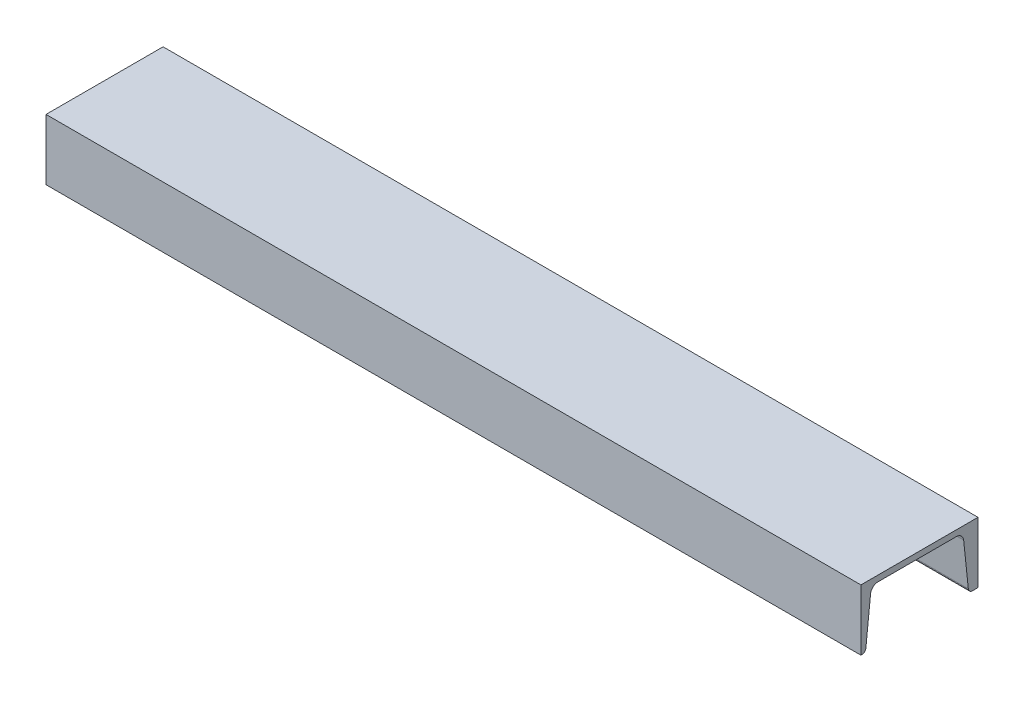
ISO-10303-21;
HEADER;
FILE_DESCRIPTION(('STEP AP214'),'2;1');
FILE_NAME('part.step','',(''),(''),'','','');
FILE_SCHEMA(('AUTOMOTIVE_DESIGN { 1 0 10303 214 1 1 1 1 }'));
ENDSEC;
DATA;
#1=APPLICATION_CONTEXT('core data for automotive mechanical design processes');
#2=APPLICATION_PROTOCOL_DEFINITION('international standard','automotive_design',2000,#1);
#3=PRODUCT_CONTEXT('',#1,'mechanical');
#4=PRODUCT('Part','Part','',(#3));
#5=PRODUCT_RELATED_PRODUCT_CATEGORY('part','',(#4));
#6=PRODUCT_DEFINITION_FORMATION('','',#4);
#7=PRODUCT_DEFINITION_CONTEXT('part definition',#1,'design');
#8=PRODUCT_DEFINITION('design','',#6,#7);
#9=PRODUCT_DEFINITION_SHAPE('','',#8);
#10=(LENGTH_UNIT() NAMED_UNIT(*) SI_UNIT(.MILLI.,.METRE.));
#11=(NAMED_UNIT(*) PLANE_ANGLE_UNIT() SI_UNIT($,.RADIAN.));
#12=(NAMED_UNIT(*) SI_UNIT($,.STERADIAN.) SOLID_ANGLE_UNIT());
#13=UNCERTAINTY_MEASURE_WITH_UNIT(LENGTH_MEASURE(1.E-05),#10,'distance_accuracy_value','');
#14=(GEOMETRIC_REPRESENTATION_CONTEXT(3) GLOBAL_UNCERTAINTY_ASSIGNED_CONTEXT((#13)) GLOBAL_UNIT_ASSIGNED_CONTEXT((#10,
#11,#12)) REPRESENTATION_CONTEXT('',''));
#15=CARTESIAN_POINT('',(0.,0.,0.));
#16=DIRECTION('',(0.,0.,1.));
#17=DIRECTION('',(1.,0.,0.));
#18=AXIS2_PLACEMENT_3D('',#15,#16,#17);
#19=CARTESIAN_POINT('',(-870.,-60.5000000000001,124.164669163818));
#20=DIRECTION('',(1.,0.,0.));
#21=DIRECTION('',(0.,1.,0.));
#22=AXIS2_PLACEMENT_3D('',#19,#20,#21);
#23=CYLINDRICAL_SURFACE('',#22,4.5);
#24=CARTESIAN_POINT('',(0.,-60.5,124.164669163818));
#25=DIRECTION('',(-1.,0.,0.));
#26=DIRECTION('',(0.,-1.,0.));
#27=AXIS2_PLACEMENT_3D('',#24,#25,#26);
#28=CIRCLE('',#27,4.5);
#29=CARTESIAN_POINT('',(0.,-60.9703780847044,119.689320634661));
#30=VERTEX_POINT('',#29);
#31=CARTESIAN_POINT('',(0.,-65.,124.164669163818));
#32=VERTEX_POINT('',#31);
#33=EDGE_CURVE('E198',#30,#32,#28,.T.);
#34=ORIENTED_EDGE('',*,*,#33,.T.);
#35=DIRECTION('',(1.,0.,0.));
#36=VECTOR('',#35,1.);
#37=CARTESIAN_POINT('',(-870.,-65.0000000000001,124.164669163818));
#38=LINE('',#37,#36);
#39=CARTESIAN_POINT('',(-870.,-65.0000000000001,124.164669163818));
#40=VERTEX_POINT('',#39);
#41=EDGE_CURVE('E13',#40,#32,#38,.T.);
#42=ORIENTED_EDGE('',*,*,#41,.F.);
#43=CARTESIAN_POINT('',(-870.,-60.5000000000001,124.164669163818));
#44=DIRECTION('',(-1.,0.,0.));
#45=DIRECTION('',(0.,-1.,0.));
#46=AXIS2_PLACEMENT_3D('',#43,#44,#45);
#47=CIRCLE('',#46,4.5);
#48=CARTESIAN_POINT('',(-870.,-60.9703780847045,119.689320634661));
#49=VERTEX_POINT('',#48);
#50=EDGE_CURVE('E220',#49,#40,#47,.T.);
#51=ORIENTED_EDGE('',*,*,#50,.F.);
#52=DIRECTION('',(1.,0.,0.));
#53=VECTOR('',#52,1.);
#54=CARTESIAN_POINT('',(-870.,-60.9703780847045,119.689320634661));
#55=LINE('',#54,#53);
#56=EDGE_CURVE('E194',#49,#30,#55,.T.);
#57=ORIENTED_EDGE('',*,*,#56,.T.);
#58=EDGE_LOOP('',(#34,#42,#51,#57));
#59=FACE_BOUND('',#58,.T.);
#60=ADVANCED_FACE('F78',(#59),#23,.T.);
#61=CARTESIAN_POINT('',(-870.,-65.0000000000001,125.));
#62=DIRECTION('',(0.,1.,0.));
#63=DIRECTION('',(-1.,0.,0.));
#64=AXIS2_PLACEMENT_3D('',#61,#62,#63);
#65=PLANE('',#64);
#66=DIRECTION('',(0.,0.,1.));
#67=VECTOR('',#66,1.);
#68=CARTESIAN_POINT('',(0.,-65.,125.));
#69=LINE('',#68,#67);
#70=CARTESIAN_POINT('',(0.,-65.,125.));
#71=VERTEX_POINT('',#70);
#72=EDGE_CURVE('E201',#32,#71,#69,.T.);
#73=ORIENTED_EDGE('',*,*,#72,.T.);
#74=DIRECTION('',(1.,0.,0.));
#75=VECTOR('',#74,1.);
#76=CARTESIAN_POINT('',(-870.,-65.0000000000001,125.));
#77=LINE('',#76,#75);
#78=CARTESIAN_POINT('',(-870.,-65.0000000000001,125.));
#79=VERTEX_POINT('',#78);
#80=EDGE_CURVE('E86',#79,#71,#77,.T.);
#81=ORIENTED_EDGE('',*,*,#80,.F.);
#82=DIRECTION('',(0.,0.,1.));
#83=VECTOR('',#82,1.);
#84=CARTESIAN_POINT('',(-870.,-65.0000000000001,125.));
#85=LINE('',#84,#83);
#86=EDGE_CURVE('E149',#40,#79,#85,.T.);
#87=ORIENTED_EDGE('',*,*,#86,.F.);
#88=ORIENTED_EDGE('',*,*,#41,.T.);
#89=EDGE_LOOP('',(#73,#81,#87,#88));
#90=FACE_BOUND('',#89,.T.);
#91=ADVANCED_FACE('F298',(#90),#65,.F.);
#92=CARTESIAN_POINT('',(-870.,-65.0000000000001,125.));
#93=DIRECTION('',(0.,0.,-1.));
#94=DIRECTION('',(0.,1.,0.));
#95=AXIS2_PLACEMENT_3D('',#92,#93,#94);
#96=PLANE('',#95);
#97=DIRECTION('',(0.,1.,0.));
#98=VECTOR('',#97,1.);
#99=CARTESIAN_POINT('',(0.,-65.,125.));
#100=LINE('',#99,#98);
#101=CARTESIAN_POINT('',(0.,0.,125.));
#102=VERTEX_POINT('',#101);
#103=EDGE_CURVE('E203',#71,#102,#100,.T.);
#104=ORIENTED_EDGE('',*,*,#103,.T.);
#105=DIRECTION('',(1.,0.,0.));
#106=VECTOR('',#105,1.);
#107=CARTESIAN_POINT('',(-870.,-1.05981336082281E-13,125.));
#108=LINE('',#107,#106);
#109=CARTESIAN_POINT('',(-870.,-1.05981336082281E-13,125.));
#110=VERTEX_POINT('',#109);
#111=EDGE_CURVE('E239',#110,#102,#108,.T.);
#112=ORIENTED_EDGE('',*,*,#111,.F.);
#113=DIRECTION('',(0.,1.,0.));
#114=VECTOR('',#113,1.);
#115=CARTESIAN_POINT('',(-870.,-65.0000000000001,125.));
#116=LINE('',#115,#114);
#117=EDGE_CURVE('E247',#79,#110,#116,.T.);
#118=ORIENTED_EDGE('',*,*,#117,.F.);
#119=ORIENTED_EDGE('',*,*,#80,.T.);
#120=EDGE_LOOP('',(#104,#112,#118,#119));
#121=FACE_BOUND('',#120,.T.);
#122=ADVANCED_FACE('F245',(#121),#96,.F.);
#123=CARTESIAN_POINT('',(-870.,-1.05981336082281E-13,125.));
#124=DIRECTION('',(0.,-1.,0.));
#125=DIRECTION('',(1.,0.,0.));
#126=AXIS2_PLACEMENT_3D('',#123,#124,#125);
#127=PLANE('',#126);
#128=DIRECTION('',(0.,0.,-1.));
#129=VECTOR('',#128,1.);
#130=CARTESIAN_POINT('',(0.,0.,125.));
#131=LINE('',#130,#129);
#132=CARTESIAN_POINT('',(0.,0.,0.));
#133=VERTEX_POINT('',#132);
#134=EDGE_CURVE('E205',#102,#133,#131,.T.);
#135=ORIENTED_EDGE('',*,*,#134,.T.);
#136=DIRECTION('',(1.,0.,0.));
#137=VECTOR('',#136,1.);
#138=CARTESIAN_POINT('',(-870.,-1.0654427152582E-13,0.));
#139=LINE('',#138,#137);
#140=CARTESIAN_POINT('',(-870.,-1.0654427152582E-13,0.));
#141=VERTEX_POINT('',#140);
#142=EDGE_CURVE('E236',#141,#133,#139,.T.);
#143=ORIENTED_EDGE('',*,*,#142,.F.);
#144=DIRECTION('',(0.,0.,-1.));
#145=VECTOR('',#144,1.);
#146=CARTESIAN_POINT('',(-870.,-1.05981336082281E-13,125.));
#147=LINE('',#146,#145);
#148=EDGE_CURVE('E265',#110,#141,#147,.T.);
#149=ORIENTED_EDGE('',*,*,#148,.F.);
#150=ORIENTED_EDGE('',*,*,#111,.T.);
#151=EDGE_LOOP('',(#135,#143,#149,#150));
#152=FACE_BOUND('',#151,.T.);
#153=ADVANCED_FACE('F256',(#152),#127,.F.);
#154=CARTESIAN_POINT('',(-870.,-65.0000000000001,0.));
#155=DIRECTION('',(0.,0.,1.));
#156=DIRECTION('',(0.,-1.,0.));
#157=AXIS2_PLACEMENT_3D('',#154,#155,#156);
#158=PLANE('',#157);
#159=DIRECTION('',(0.,-1.,0.));
#160=VECTOR('',#159,1.);
#161=CARTESIAN_POINT('',(0.,-65.,0.));
#162=LINE('',#161,#160);
#163=CARTESIAN_POINT('',(0.,-65.,0.));
#164=VERTEX_POINT('',#163);
#165=EDGE_CURVE('E207',#133,#164,#162,.T.);
#166=ORIENTED_EDGE('',*,*,#165,.T.);
#167=DIRECTION('',(1.,0.,0.));
#168=VECTOR('',#167,1.);
#169=CARTESIAN_POINT('',(-870.,-65.0000000000001,0.));
#170=LINE('',#169,#168);
#171=CARTESIAN_POINT('',(-870.,-65.0000000000001,0.));
#172=VERTEX_POINT('',#171);
#173=EDGE_CURVE('E233',#172,#164,#170,.T.);
#174=ORIENTED_EDGE('',*,*,#173,.F.);
#175=DIRECTION('',(0.,-1.,0.));
#176=VECTOR('',#175,1.);
#177=CARTESIAN_POINT('',(-870.,-65.0000000000001,0.));
#178=LINE('',#177,#176);
#179=EDGE_CURVE('E262',#141,#172,#178,.T.);
#180=ORIENTED_EDGE('',*,*,#179,.F.);
#181=ORIENTED_EDGE('',*,*,#142,.T.);
#182=EDGE_LOOP('',(#166,#174,#180,#181));
#183=FACE_BOUND('',#182,.T.);
#184=ADVANCED_FACE('F260',(#183),#158,.F.);
#185=CARTESIAN_POINT('',(-870.,-65.0000000000001,0.));
#186=DIRECTION('',(0.,1.,0.));
#187=DIRECTION('',(0.,0.,1.));
#188=AXIS2_PLACEMENT_3D('',#185,#186,#187);
#189=PLANE('',#188);
#190=DIRECTION('',(0.,0.,1.));
#191=VECTOR('',#190,1.);
#192=CARTESIAN_POINT('',(0.,-65.,0.));
#193=LINE('',#192,#191);
#194=CARTESIAN_POINT('',(0.,-65.,5.84533083618209));
#195=VERTEX_POINT('',#194);
#196=EDGE_CURVE('E209',#164,#195,#193,.T.);
#197=ORIENTED_EDGE('',*,*,#196,.T.);
#198=DIRECTION('',(1.,0.,0.));
#199=VECTOR('',#198,1.);
#200=CARTESIAN_POINT('',(-870.,-65.0000000000001,5.84533083618209));
#201=LINE('',#200,#199);
#202=CARTESIAN_POINT('',(-870.,-65.0000000000001,5.84533083618209));
#203=VERTEX_POINT('',#202);
#204=EDGE_CURVE('E230',#203,#195,#201,.T.);
#205=ORIENTED_EDGE('',*,*,#204,.F.);
#206=DIRECTION('',(0.,0.,1.));
#207=VECTOR('',#206,1.);
#208=CARTESIAN_POINT('',(-870.,-65.0000000000001,0.));
#209=LINE('',#208,#207);
#210=EDGE_CURVE('E264',#172,#203,#209,.T.);
#211=ORIENTED_EDGE('',*,*,#210,.F.);
#212=ORIENTED_EDGE('',*,*,#173,.T.);
#213=EDGE_LOOP('',(#197,#205,#211,#212));
#214=FACE_BOUND('',#213,.T.);
#215=ADVANCED_FACE('F311',(#214),#189,.F.);
#216=CARTESIAN_POINT('',(-870.,-60.5000000000001,5.84533083618209));
#217=DIRECTION('',(1.,0.,0.));
#218=DIRECTION('',(0.,1.,0.));
#219=AXIS2_PLACEMENT_3D('',#216,#217,#218);
#220=CYLINDRICAL_SURFACE('',#219,4.5);
#221=CARTESIAN_POINT('',(0.,-60.5,5.84533083618209));
#222=DIRECTION('',(-1.,0.,0.));
#223=DIRECTION('',(0.,1.,0.));
#224=AXIS2_PLACEMENT_3D('',#221,#222,#223);
#225=CIRCLE('',#224,4.5);
#226=CARTESIAN_POINT('',(0.,-60.9703780847044,10.3206793653393));
#227=VERTEX_POINT('',#226);
#228=EDGE_CURVE('E211',#195,#227,#225,.T.);
#229=ORIENTED_EDGE('',*,*,#228,.T.);
#230=DIRECTION('',(1.,0.,0.));
#231=VECTOR('',#230,1.);
#232=CARTESIAN_POINT('',(-870.,-60.9703780847045,10.3206793653393));
#233=LINE('',#232,#231);
#234=CARTESIAN_POINT('',(-870.,-60.9703780847045,10.3206793653393));
#235=VERTEX_POINT('',#234);
#236=EDGE_CURVE('E227',#235,#227,#233,.T.);
#237=ORIENTED_EDGE('',*,*,#236,.F.);
#238=CARTESIAN_POINT('',(-870.,-60.5000000000001,5.84533083618209));
#239=DIRECTION('',(-1.,0.,0.));
#240=DIRECTION('',(0.,1.,0.));
#241=AXIS2_PLACEMENT_3D('',#238,#239,#240);
#242=CIRCLE('',#241,4.5);
#243=EDGE_CURVE('E267',#203,#235,#242,.T.);
#244=ORIENTED_EDGE('',*,*,#243,.F.);
#245=ORIENTED_EDGE('',*,*,#204,.T.);
#246=EDGE_LOOP('',(#229,#237,#244,#245));
#247=FACE_BOUND('',#246,.T.);
#248=ADVANCED_FACE('F314',(#247),#220,.T.);
#249=CARTESIAN_POINT('',(-870.,-13.4637722938589,15.3138248370538));
#250=DIRECTION('',(0.,0.104528463267647,-0.994521895368274));
#251=DIRECTION('',(0.,0.994521895368274,0.104528463267647));
#252=AXIS2_PLACEMENT_3D('',#249,#250,#251);
#253=PLANE('',#252);
#254=DIRECTION('',(0.,0.994521895368274,0.104528463267647));
#255=VECTOR('',#254,1.);
#256=CARTESIAN_POINT('',(0.,-13.4637722938588,15.3138248370538));
#257=LINE('',#256,#255);
#258=CARTESIAN_POINT('',(0.,-13.4637722938588,15.3138248370538));
#259=VERTEX_POINT('',#258);
#260=EDGE_CURVE('E213',#227,#259,#257,.T.);
#261=ORIENTED_EDGE('',*,*,#260,.T.);
#262=DIRECTION('',(1.,0.,0.));
#263=VECTOR('',#262,1.);
#264=CARTESIAN_POINT('',(-870.,-13.4637722938589,15.3138248370538));
#265=LINE('',#264,#263);
#266=CARTESIAN_POINT('',(-870.,-13.4637722938589,15.3138248370538));
#267=VERTEX_POINT('',#266);
#268=EDGE_CURVE('E224',#267,#259,#265,.T.);
#269=ORIENTED_EDGE('',*,*,#268,.F.);
#270=DIRECTION('',(0.,0.994521895368274,0.104528463267647));
#271=VECTOR('',#270,1.);
#272=CARTESIAN_POINT('',(-870.,-13.4637722938589,15.3138248370538));
#273=LINE('',#272,#271);
#274=EDGE_CURVE('E273',#235,#267,#273,.T.);
#275=ORIENTED_EDGE('',*,*,#274,.F.);
#276=ORIENTED_EDGE('',*,*,#236,.T.);
#277=EDGE_LOOP('',(#261,#269,#275,#276));
#278=FACE_BOUND('',#277,.T.);
#279=ADVANCED_FACE('F279',(#278),#253,.F.);
#280=CARTESIAN_POINT('',(-870.,-14.3000000000001,23.27));
#281=DIRECTION('',(1.,0.,0.));
#282=DIRECTION('',(0.,1.,0.));
#283=AXIS2_PLACEMENT_3D('',#280,#281,#282);
#284=CYLINDRICAL_SURFACE('',#283,8.);
#285=CARTESIAN_POINT('',(0.,-14.3,23.27));
#286=DIRECTION('',(1.,0.,0.));
#287=DIRECTION('',(0.,-1.,0.));
#288=AXIS2_PLACEMENT_3D('',#285,#286,#287);
#289=CIRCLE('',#288,8.);
#290=CARTESIAN_POINT('',(0.,-6.30000000000001,23.27));
#291=VERTEX_POINT('',#290);
#292=EDGE_CURVE('E215',#259,#291,#289,.T.);
#293=ORIENTED_EDGE('',*,*,#292,.T.);
#294=DIRECTION('',(1.,0.,0.));
#295=VECTOR('',#294,1.);
#296=CARTESIAN_POINT('',(-870.,-6.30000000000012,23.27));
#297=LINE('',#296,#295);
#298=CARTESIAN_POINT('',(-870.,-6.30000000000012,23.27));
#299=VERTEX_POINT('',#298);
#300=EDGE_CURVE('E189',#299,#291,#297,.T.);
#301=ORIENTED_EDGE('',*,*,#300,.F.);
#302=CARTESIAN_POINT('',(-870.,-14.3000000000001,23.27));
#303=DIRECTION('',(1.,0.,0.));
#304=DIRECTION('',(0.,-1.,0.));
#305=AXIS2_PLACEMENT_3D('',#302,#303,#304);
#306=CIRCLE('',#305,8.);
#307=EDGE_CURVE('E180',#267,#299,#306,.T.);
#308=ORIENTED_EDGE('',*,*,#307,.F.);
#309=ORIENTED_EDGE('',*,*,#268,.T.);
#310=EDGE_LOOP('',(#293,#301,#308,#309));
#311=FACE_BOUND('',#310,.T.);
#312=ADVANCED_FACE('F283',(#311),#284,.F.);
#313=CARTESIAN_POINT('',(-870.,-6.30000000000011,106.74));
#314=DIRECTION('',(0.,1.,0.));
#315=DIRECTION('',(0.,0.,1.));
#316=AXIS2_PLACEMENT_3D('',#313,#314,#315);
#317=PLANE('',#316);
#318=DIRECTION('',(0.,0.,1.));
#319=VECTOR('',#318,1.);
#320=CARTESIAN_POINT('',(0.,-6.3,106.74));
#321=LINE('',#320,#319);
#322=CARTESIAN_POINT('',(0.,-6.3,106.74));
#323=VERTEX_POINT('',#322);
#324=EDGE_CURVE('E188',#291,#323,#321,.T.);
#325=ORIENTED_EDGE('',*,*,#324,.T.);
#326=DIRECTION('',(1.,0.,0.));
#327=VECTOR('',#326,1.);
#328=CARTESIAN_POINT('',(-870.,-6.30000000000011,106.74));
#329=LINE('',#328,#327);
#330=CARTESIAN_POINT('',(-870.,-6.30000000000011,106.74));
#331=VERTEX_POINT('',#330);
#332=EDGE_CURVE('E185',#331,#323,#329,.T.);
#333=ORIENTED_EDGE('',*,*,#332,.F.);
#334=DIRECTION('',(0.,0.,1.));
#335=VECTOR('',#334,1.);
#336=CARTESIAN_POINT('',(-870.,-6.30000000000011,106.74));
#337=LINE('',#336,#335);
#338=EDGE_CURVE('E174',#299,#331,#337,.T.);
#339=ORIENTED_EDGE('',*,*,#338,.F.);
#340=ORIENTED_EDGE('',*,*,#300,.T.);
#341=EDGE_LOOP('',(#325,#333,#339,#340));
#342=FACE_BOUND('',#341,.T.);
#343=ADVANCED_FACE('F186',(#342),#317,.F.);
#344=CARTESIAN_POINT('',(-870.,-14.3000000000001,106.74));
#345=DIRECTION('',(1.,0.,0.));
#346=DIRECTION('',(0.,1.,0.));
#347=AXIS2_PLACEMENT_3D('',#344,#345,#346);
#348=CYLINDRICAL_SURFACE('',#347,8.);
#349=CARTESIAN_POINT('',(0.,-14.3,106.74));
#350=DIRECTION('',(1.,0.,0.));
#351=DIRECTION('',(0.,1.,0.));
#352=AXIS2_PLACEMENT_3D('',#349,#350,#351);
#353=CIRCLE('',#352,8.);
#354=CARTESIAN_POINT('',(0.,-13.4637722938588,114.696175162946));
#355=VERTEX_POINT('',#354);
#356=EDGE_CURVE('E135',#323,#355,#353,.T.);
#357=ORIENTED_EDGE('',*,*,#356,.T.);
#358=DIRECTION('',(1.,0.,0.));
#359=VECTOR('',#358,1.);
#360=CARTESIAN_POINT('',(-870.,-13.4637722938589,114.696175162946));
#361=LINE('',#360,#359);
#362=CARTESIAN_POINT('',(-870.,-13.4637722938589,114.696175162946));
#363=VERTEX_POINT('',#362);
#364=EDGE_CURVE('E190',#363,#355,#361,.T.);
#365=ORIENTED_EDGE('',*,*,#364,.F.);
#366=CARTESIAN_POINT('',(-870.,-14.3000000000001,106.74));
#367=DIRECTION('',(1.,0.,0.));
#368=DIRECTION('',(0.,1.,0.));
#369=AXIS2_PLACEMENT_3D('',#366,#367,#368);
#370=CIRCLE('',#369,8.);
#371=EDGE_CURVE('E178',#331,#363,#370,.T.);
#372=ORIENTED_EDGE('',*,*,#371,.F.);
#373=ORIENTED_EDGE('',*,*,#332,.T.);
#374=EDGE_LOOP('',(#357,#365,#372,#373));
#375=FACE_BOUND('',#374,.T.);
#376=ADVANCED_FACE('F192',(#375),#348,.F.);
#377=CARTESIAN_POINT('',(-870.,-13.4637722938589,114.696175162946));
#378=DIRECTION('',(0.,0.104528463267646,0.994521895368274));
#379=DIRECTION('',(0.,-0.994521895368274,0.104528463267646));
#380=AXIS2_PLACEMENT_3D('',#377,#378,#379);
#381=PLANE('',#380);
#382=DIRECTION('',(0.,-0.994521895368274,0.104528463267646));
#383=VECTOR('',#382,1.);
#384=CARTESIAN_POINT('',(0.,-13.4637722938588,114.696175162946));
#385=LINE('',#384,#383);
#386=EDGE_CURVE('E141',#355,#30,#385,.T.);
#387=ORIENTED_EDGE('',*,*,#386,.T.);
#388=ORIENTED_EDGE('',*,*,#56,.F.);
#389=DIRECTION('',(0.,-0.994521895368274,0.104528463267646));
#390=VECTOR('',#389,1.);
#391=CARTESIAN_POINT('',(-870.,-13.4637722938589,114.696175162946));
#392=LINE('',#391,#390);
#393=EDGE_CURVE('E94',#363,#49,#392,.T.);
#394=ORIENTED_EDGE('',*,*,#393,.F.);
#395=ORIENTED_EDGE('',*,*,#364,.T.);
#396=EDGE_LOOP('',(#387,#388,#394,#395));
#397=FACE_BOUND('',#396,.T.);
#398=ADVANCED_FACE('F287',(#397),#381,.F.);
#399=CARTESIAN_POINT('',(-870.,-60.5000000000001,124.164669163818));
#400=DIRECTION('',(-1.,0.,0.));
#401=DIRECTION('',(0.,-1.,0.));
#402=AXIS2_PLACEMENT_3D('',#399,#400,#401);
#403=PLANE('',#402);
#404=ORIENTED_EDGE('',*,*,#50,.T.);
#405=ORIENTED_EDGE('',*,*,#86,.T.);
#406=ORIENTED_EDGE('',*,*,#117,.T.);
#407=ORIENTED_EDGE('',*,*,#148,.T.);
#408=ORIENTED_EDGE('',*,*,#179,.T.);
#409=ORIENTED_EDGE('',*,*,#210,.T.);
#410=ORIENTED_EDGE('',*,*,#243,.T.);
#411=ORIENTED_EDGE('',*,*,#274,.T.);
#412=ORIENTED_EDGE('',*,*,#307,.T.);
#413=ORIENTED_EDGE('',*,*,#338,.T.);
#414=ORIENTED_EDGE('',*,*,#371,.T.);
#415=ORIENTED_EDGE('',*,*,#393,.T.);
#416=EDGE_LOOP('',(#404,#405,#406,#407,#408,#409,#410,#411,#412,#413,#414,#415));
#417=FACE_BOUND('',#416,.T.);
#418=ADVANCED_FACE('F176',(#417),#403,.T.);
#419=CARTESIAN_POINT('',(0.,-60.5,124.164669163818));
#420=DIRECTION('',(-1.,0.,0.));
#421=DIRECTION('',(0.,-1.,0.));
#422=AXIS2_PLACEMENT_3D('',#419,#420,#421);
#423=PLANE('',#422);
#424=ORIENTED_EDGE('',*,*,#33,.F.);
#425=ORIENTED_EDGE('',*,*,#386,.F.);
#426=ORIENTED_EDGE('',*,*,#356,.F.);
#427=ORIENTED_EDGE('',*,*,#324,.F.);
#428=ORIENTED_EDGE('',*,*,#292,.F.);
#429=ORIENTED_EDGE('',*,*,#260,.F.);
#430=ORIENTED_EDGE('',*,*,#228,.F.);
#431=ORIENTED_EDGE('',*,*,#196,.F.);
#432=ORIENTED_EDGE('',*,*,#165,.F.);
#433=ORIENTED_EDGE('',*,*,#134,.F.);
#434=ORIENTED_EDGE('',*,*,#103,.F.);
#435=ORIENTED_EDGE('',*,*,#72,.F.);
#436=EDGE_LOOP('',(#424,#425,#426,#427,#428,#429,#430,#431,#432,#433,#434,#435));
#437=FACE_BOUND('',#436,.T.);
#438=ADVANCED_FACE('F251',(#437),#423,.F.);
#439=CLOSED_SHELL('',(#60,#91,#122,#153,#184,#215,#248,#279,#312,#343,#376,#398,#418,#438));
#440=MANIFOLD_SOLID_BREP('B2',#439);
#441=ADVANCED_BREP_SHAPE_REPRESENTATION('',(#18,#440),#14);
#442=SHAPE_DEFINITION_REPRESENTATION(#9,#441);
ENDSEC;
END-ISO-10303-21;
